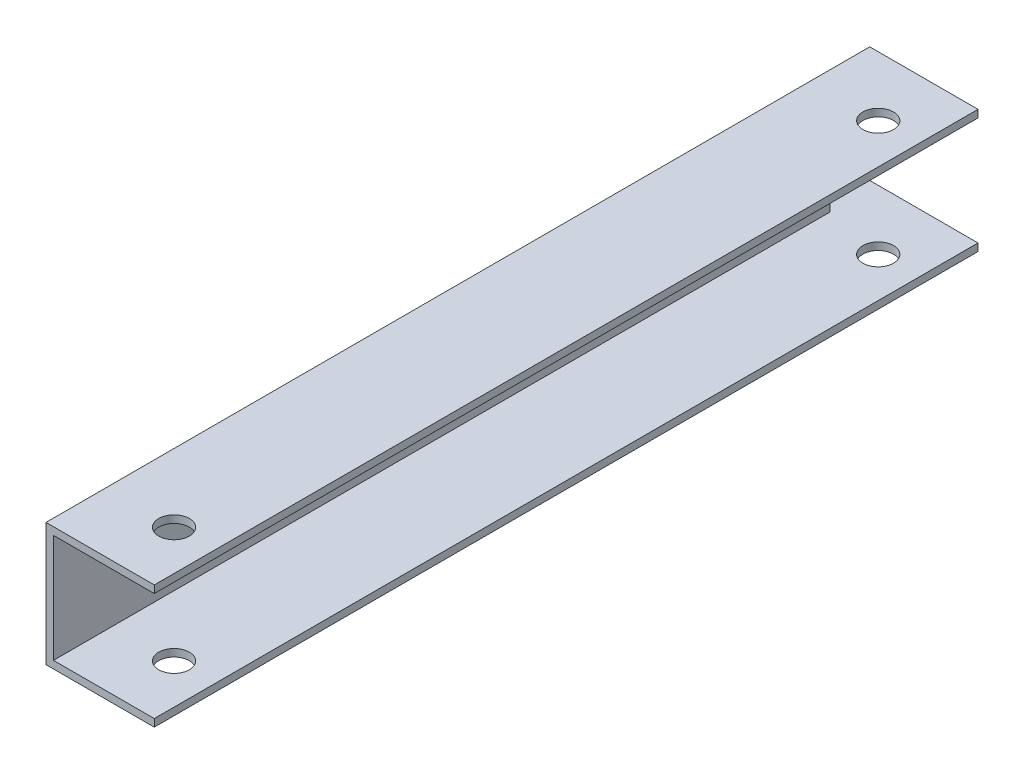
ISO-10303-21;
HEADER;
FILE_DESCRIPTION(('STEP AP214'),'2;1');
FILE_NAME('part.step','',(''),(''),'','','');
FILE_SCHEMA(('AUTOMOTIVE_DESIGN { 1 0 10303 214 1 1 1 1 }'));
ENDSEC;
DATA;
#1=APPLICATION_CONTEXT('core data for automotive mechanical design processes');
#2=APPLICATION_PROTOCOL_DEFINITION('international standard','automotive_design',2000,#1);
#3=PRODUCT_CONTEXT('',#1,'mechanical');
#4=PRODUCT('Part','Part','',(#3));
#5=PRODUCT_RELATED_PRODUCT_CATEGORY('part','',(#4));
#6=PRODUCT_DEFINITION_FORMATION('','',#4);
#7=PRODUCT_DEFINITION_CONTEXT('part definition',#1,'design');
#8=PRODUCT_DEFINITION('design','',#6,#7);
#9=PRODUCT_DEFINITION_SHAPE('','',#8);
#10=(LENGTH_UNIT() NAMED_UNIT(*) SI_UNIT(.MILLI.,.METRE.));
#11=(NAMED_UNIT(*) PLANE_ANGLE_UNIT() SI_UNIT($,.RADIAN.));
#12=(NAMED_UNIT(*) SI_UNIT($,.STERADIAN.) SOLID_ANGLE_UNIT());
#13=UNCERTAINTY_MEASURE_WITH_UNIT(LENGTH_MEASURE(1.E-05),#10,'distance_accuracy_value','');
#14=(GEOMETRIC_REPRESENTATION_CONTEXT(3) GLOBAL_UNCERTAINTY_ASSIGNED_CONTEXT((#13)) GLOBAL_UNIT_ASSIGNED_CONTEXT((#10,
#11,#12)) REPRESENTATION_CONTEXT('',''));
#15=CARTESIAN_POINT('',(0.,0.,0.));
#16=DIRECTION('',(0.,0.,1.));
#17=DIRECTION('',(1.,0.,0.));
#18=AXIS2_PLACEMENT_3D('',#15,#16,#17);
#19=CARTESIAN_POINT('',(0.,0.,-175.));
#20=DIRECTION('',(0.,0.,-1.));
#21=DIRECTION('',(-1.,0.,0.));
#22=AXIS2_PLACEMENT_3D('',#19,#20,#21);
#23=PLANE('',#22);
#24=DIRECTION('',(1.,0.,0.));
#25=VECTOR('',#24,1.);
#26=CARTESIAN_POINT('',(23.,23.,-175.));
#27=LINE('',#26,#25);
#28=CARTESIAN_POINT('',(-23.,23.,-175.));
#29=VERTEX_POINT('',#28);
#30=CARTESIAN_POINT('',(23.,23.,-175.));
#31=VERTEX_POINT('',#30);
#32=EDGE_CURVE('E83',#29,#31,#27,.T.);
#33=ORIENTED_EDGE('',*,*,#32,.F.);
#34=DIRECTION('',(0.,-1.,0.));
#35=VECTOR('',#34,1.);
#36=CARTESIAN_POINT('',(-23.,-26.175,-175.));
#37=LINE('',#36,#35);
#38=CARTESIAN_POINT('',(-23.,26.175,-175.));
#39=VERTEX_POINT('',#38);
#40=EDGE_CURVE('E144',#39,#29,#37,.T.);
#41=ORIENTED_EDGE('',*,*,#40,.F.);
#42=DIRECTION('',(-1.,0.,0.));
#43=VECTOR('',#42,1.);
#44=CARTESIAN_POINT('',(-23.,26.175,-175.));
#45=LINE('',#44,#43);
#46=CARTESIAN_POINT('',(23.,26.175,-175.));
#47=VERTEX_POINT('',#46);
#48=EDGE_CURVE('E140',#47,#39,#45,.T.);
#49=ORIENTED_EDGE('',*,*,#48,.F.);
#50=DIRECTION('',(0.,1.,0.));
#51=VECTOR('',#50,1.);
#52=CARTESIAN_POINT('',(23.,26.175,-175.));
#53=LINE('',#52,#51);
#54=EDGE_CURVE('E137',#31,#47,#53,.T.);
#55=ORIENTED_EDGE('',*,*,#54,.F.);
#56=EDGE_LOOP('',(#33,#41,#49,#55));
#57=FACE_BOUND('',#56,.T.);
#58=ADVANCED_FACE('F33',(#57),#23,.T.);
#59=CARTESIAN_POINT('',(23.,26.175,175.));
#60=DIRECTION('',(-1.,0.,0.));
#61=DIRECTION('',(0.,0.,1.));
#62=AXIS2_PLACEMENT_3D('',#59,#60,#61);
#63=PLANE('',#62);
#64=ORIENTED_EDGE('',*,*,#54,.T.);
#65=DIRECTION('',(0.,0.,-1.));
#66=VECTOR('',#65,1.);
#67=CARTESIAN_POINT('',(23.,26.175,175.));
#68=LINE('',#67,#66);
#69=CARTESIAN_POINT('',(23.,26.175,175.));
#70=VERTEX_POINT('',#69);
#71=EDGE_CURVE('E11',#70,#47,#68,.T.);
#72=ORIENTED_EDGE('',*,*,#71,.F.);
#73=DIRECTION('',(0.,1.,0.));
#74=VECTOR('',#73,1.);
#75=CARTESIAN_POINT('',(23.,26.175,175.));
#76=LINE('',#75,#74);
#77=CARTESIAN_POINT('',(23.,23.,175.));
#78=VERTEX_POINT('',#77);
#79=EDGE_CURVE('E154',#78,#70,#76,.T.);
#80=ORIENTED_EDGE('',*,*,#79,.F.);
#81=DIRECTION('',(0.,0.,-1.));
#82=VECTOR('',#81,1.);
#83=CARTESIAN_POINT('',(23.,23.,175.));
#84=LINE('',#83,#82);
#85=EDGE_CURVE('E133',#78,#31,#84,.T.);
#86=ORIENTED_EDGE('',*,*,#85,.T.);
#87=EDGE_LOOP('',(#64,#72,#80,#86));
#88=FACE_BOUND('',#87,.T.);
#89=ADVANCED_FACE('F35',(#88),#63,.F.);
#90=CARTESIAN_POINT('',(-23.,26.175,175.));
#91=DIRECTION('',(0.,-1.,0.));
#92=DIRECTION('',(0.,0.,-1.));
#93=AXIS2_PLACEMENT_3D('',#90,#91,#92);
#94=PLANE('',#93);
#95=CARTESIAN_POINT('',(5.99999999999999,26.175,149.6));
#96=DIRECTION('',(0.,-1.,0.));
#97=DIRECTION('',(0.,0.,-1.));
#98=AXIS2_PLACEMENT_3D('',#95,#96,#97);
#99=CIRCLE('',#98,6.50000000000001);
#100=CARTESIAN_POINT('',(5.99999999999999,26.175,143.1));
#101=VERTEX_POINT('',#100);
#102=EDGE_CURVE('E141',#101,#101,#99,.T.);
#103=ORIENTED_EDGE('',*,*,#102,.T.);
#104=EDGE_LOOP('',(#103));
#105=FACE_BOUND('',#104,.T.);
#106=CARTESIAN_POINT('',(6.00000000000003,26.175,-149.6));
#107=DIRECTION('',(0.,-1.,0.));
#108=DIRECTION('',(0.,0.,-1.));
#109=AXIS2_PLACEMENT_3D('',#106,#107,#108);
#110=CIRCLE('',#109,6.50000000000001);
#111=CARTESIAN_POINT('',(6.00000000000003,26.175,-156.1));
#112=VERTEX_POINT('',#111);
#113=EDGE_CURVE('E171',#112,#112,#110,.T.);
#114=ORIENTED_EDGE('',*,*,#113,.T.);
#115=EDGE_LOOP('',(#114));
#116=FACE_BOUND('',#115,.T.);
#117=ORIENTED_EDGE('',*,*,#48,.T.);
#118=DIRECTION('',(0.,0.,-1.));
#119=VECTOR('',#118,1.);
#120=CARTESIAN_POINT('',(-23.,26.175,175.));
#121=LINE('',#120,#119);
#122=CARTESIAN_POINT('',(-23.,26.175,175.));
#123=VERTEX_POINT('',#122);
#124=EDGE_CURVE('E43',#123,#39,#121,.T.);
#125=ORIENTED_EDGE('',*,*,#124,.F.);
#126=DIRECTION('',(-1.,0.,0.));
#127=VECTOR('',#126,1.);
#128=CARTESIAN_POINT('',(-23.,26.175,175.));
#129=LINE('',#128,#127);
#130=EDGE_CURVE('E91',#70,#123,#129,.T.);
#131=ORIENTED_EDGE('',*,*,#130,.F.);
#132=ORIENTED_EDGE('',*,*,#71,.T.);
#133=EDGE_LOOP('',(#117,#125,#131,#132));
#134=FACE_BOUND('',#133,.T.);
#135=ADVANCED_FACE('F240',(#105,#116,#134),#94,.F.);
#136=CARTESIAN_POINT('',(-23.,-26.175,175.));
#137=DIRECTION('',(1.,0.,0.));
#138=DIRECTION('',(0.,0.,-1.));
#139=AXIS2_PLACEMENT_3D('',#136,#137,#138);
#140=PLANE('',#139);
#141=ORIENTED_EDGE('',*,*,#40,.T.);
#142=DIRECTION('',(0.,0.,-1.));
#143=VECTOR('',#142,1.);
#144=CARTESIAN_POINT('',(-23.,23.,-175.));
#145=LINE('',#144,#143);
#146=CARTESIAN_POINT('',(-23.,23.,-155.));
#147=VERTEX_POINT('',#146);
#148=EDGE_CURVE('E220',#147,#29,#145,.T.);
#149=ORIENTED_EDGE('',*,*,#148,.F.);
#150=DIRECTION('',(0.,1.,0.));
#151=VECTOR('',#150,1.);
#152=CARTESIAN_POINT('',(-23.,23.,-155.));
#153=LINE('',#152,#151);
#154=CARTESIAN_POINT('',(-23.,-23.,-155.));
#155=VERTEX_POINT('',#154);
#156=EDGE_CURVE('E218',#155,#147,#153,.T.);
#157=ORIENTED_EDGE('',*,*,#156,.F.);
#158=DIRECTION('',(0.,0.,1.));
#159=VECTOR('',#158,1.);
#160=CARTESIAN_POINT('',(-23.,-23.,-175.));
#161=LINE('',#160,#159);
#162=CARTESIAN_POINT('',(-23.,-23.,-175.));
#163=VERTEX_POINT('',#162);
#164=EDGE_CURVE('E215',#163,#155,#161,.T.);
#165=ORIENTED_EDGE('',*,*,#164,.F.);
#166=CARTESIAN_POINT('',(-23.,-26.175,-175.));
#167=VERTEX_POINT('',#166);
#168=EDGE_CURVE('E143',#163,#167,#37,.T.);
#169=ORIENTED_EDGE('',*,*,#168,.T.);
#170=DIRECTION('',(0.,0.,-1.));
#171=VECTOR('',#170,1.);
#172=CARTESIAN_POINT('',(-23.,-26.175,175.));
#173=LINE('',#172,#171);
#174=CARTESIAN_POINT('',(-23.,-26.175,175.));
#175=VERTEX_POINT('',#174);
#176=EDGE_CURVE('E160',#175,#167,#173,.T.);
#177=ORIENTED_EDGE('',*,*,#176,.F.);
#178=DIRECTION('',(0.,-1.,0.));
#179=VECTOR('',#178,1.);
#180=CARTESIAN_POINT('',(-23.,-26.175,175.));
#181=LINE('',#180,#179);
#182=EDGE_CURVE('E193',#123,#175,#181,.T.);
#183=ORIENTED_EDGE('',*,*,#182,.F.);
#184=ORIENTED_EDGE('',*,*,#124,.T.);
#185=EDGE_LOOP('',(#141,#149,#157,#165,#169,#177,#183,#184));
#186=FACE_BOUND('',#185,.T.);
#187=ADVANCED_FACE('F213',(#186),#140,.F.);
#188=CARTESIAN_POINT('',(23.,-26.175,175.));
#189=DIRECTION('',(0.,1.,0.));
#190=DIRECTION('',(-1.,0.,0.));
#191=AXIS2_PLACEMENT_3D('',#188,#189,#190);
#192=PLANE('',#191);
#193=CARTESIAN_POINT('',(6.,-26.175,149.6));
#194=DIRECTION('',(0.,-1.,0.));
#195=DIRECTION('',(1.,0.,0.));
#196=AXIS2_PLACEMENT_3D('',#193,#194,#195);
#197=CIRCLE('',#196,6.50000000000001);
#198=CARTESIAN_POINT('',(12.5,-26.175,149.6));
#199=VERTEX_POINT('',#198);
#200=EDGE_CURVE('E167',#199,#199,#197,.T.);
#201=ORIENTED_EDGE('',*,*,#200,.F.);
#202=EDGE_LOOP('',(#201));
#203=FACE_BOUND('',#202,.T.);
#204=CARTESIAN_POINT('',(6.00000000000003,-26.175,-149.6));
#205=DIRECTION('',(0.,-1.,0.));
#206=DIRECTION('',(-1.,0.,0.));
#207=AXIS2_PLACEMENT_3D('',#204,#205,#206);
#208=CIRCLE('',#207,6.50000000000001);
#209=CARTESIAN_POINT('',(-0.499999999999971,-26.175,-149.6));
#210=VERTEX_POINT('',#209);
#211=EDGE_CURVE('E174',#210,#210,#208,.T.);
#212=ORIENTED_EDGE('',*,*,#211,.F.);
#213=EDGE_LOOP('',(#212));
#214=FACE_BOUND('',#213,.T.);
#215=DIRECTION('',(1.,0.,0.));
#216=VECTOR('',#215,1.);
#217=CARTESIAN_POINT('',(23.,-26.175,-175.));
#218=LINE('',#217,#216);
#219=CARTESIAN_POINT('',(23.,-26.175,-175.));
#220=VERTEX_POINT('',#219);
#221=EDGE_CURVE('E147',#167,#220,#218,.T.);
#222=ORIENTED_EDGE('',*,*,#221,.T.);
#223=DIRECTION('',(0.,0.,-1.));
#224=VECTOR('',#223,1.);
#225=CARTESIAN_POINT('',(23.,-26.175,175.));
#226=LINE('',#225,#224);
#227=CARTESIAN_POINT('',(23.,-26.175,175.));
#228=VERTEX_POINT('',#227);
#229=EDGE_CURVE('E158',#228,#220,#226,.T.);
#230=ORIENTED_EDGE('',*,*,#229,.F.);
#231=DIRECTION('',(1.,0.,0.));
#232=VECTOR('',#231,1.);
#233=CARTESIAN_POINT('',(23.,-26.175,175.));
#234=LINE('',#233,#232);
#235=EDGE_CURVE('E195',#175,#228,#234,.T.);
#236=ORIENTED_EDGE('',*,*,#235,.F.);
#237=ORIENTED_EDGE('',*,*,#176,.T.);
#238=EDGE_LOOP('',(#222,#230,#236,#237));
#239=FACE_BOUND('',#238,.T.);
#240=ADVANCED_FACE('F201',(#203,#214,#239),#192,.F.);
#241=CARTESIAN_POINT('',(23.,-23.,175.));
#242=DIRECTION('',(-1.,0.,0.));
#243=DIRECTION('',(0.,-1.,0.));
#244=AXIS2_PLACEMENT_3D('',#241,#242,#243);
#245=PLANE('',#244);
#246=DIRECTION('',(0.,1.,0.));
#247=VECTOR('',#246,1.);
#248=CARTESIAN_POINT('',(23.,-23.,-175.));
#249=LINE('',#248,#247);
#250=CARTESIAN_POINT('',(23.,-23.,-175.));
#251=VERTEX_POINT('',#250);
#252=EDGE_CURVE('E76',#220,#251,#249,.T.);
#253=ORIENTED_EDGE('',*,*,#252,.T.);
#254=DIRECTION('',(0.,0.,-1.));
#255=VECTOR('',#254,1.);
#256=CARTESIAN_POINT('',(23.,-23.,175.));
#257=LINE('',#256,#255);
#258=CARTESIAN_POINT('',(23.,-23.,175.));
#259=VERTEX_POINT('',#258);
#260=EDGE_CURVE('E127',#259,#251,#257,.T.);
#261=ORIENTED_EDGE('',*,*,#260,.F.);
#262=DIRECTION('',(0.,1.,0.));
#263=VECTOR('',#262,1.);
#264=CARTESIAN_POINT('',(23.,-23.,175.));
#265=LINE('',#264,#263);
#266=EDGE_CURVE('E113',#228,#259,#265,.T.);
#267=ORIENTED_EDGE('',*,*,#266,.F.);
#268=ORIENTED_EDGE('',*,*,#229,.T.);
#269=EDGE_LOOP('',(#253,#261,#267,#268));
#270=FACE_BOUND('',#269,.T.);
#271=ADVANCED_FACE('F203',(#270),#245,.F.);
#272=CARTESIAN_POINT('',(-19.825,-23.,175.));
#273=DIRECTION('',(0.,-1.,0.));
#274=DIRECTION('',(1.,0.,0.));
#275=AXIS2_PLACEMENT_3D('',#272,#273,#274);
#276=PLANE('',#275);
#277=DIRECTION('',(-1.,0.,0.));
#278=VECTOR('',#277,1.);
#279=CARTESIAN_POINT('',(-13.,-23.,-155.));
#280=LINE('',#279,#278);
#281=CARTESIAN_POINT('',(-19.825,-23.,-155.));
#282=VERTEX_POINT('',#281);
#283=EDGE_CURVE('E124',#282,#155,#280,.T.);
#284=ORIENTED_EDGE('',*,*,#283,.F.);
#285=DIRECTION('',(0.,0.,-1.));
#286=VECTOR('',#285,1.);
#287=CARTESIAN_POINT('',(-19.825,-23.,175.));
#288=LINE('',#287,#286);
#289=CARTESIAN_POINT('',(-19.825,-23.,175.));
#290=VERTEX_POINT('',#289);
#291=EDGE_CURVE('E118',#290,#282,#288,.T.);
#292=ORIENTED_EDGE('',*,*,#291,.F.);
#293=DIRECTION('',(-1.,0.,0.));
#294=VECTOR('',#293,1.);
#295=CARTESIAN_POINT('',(-19.825,-23.,175.));
#296=LINE('',#295,#294);
#297=EDGE_CURVE('E106',#259,#290,#296,.T.);
#298=ORIENTED_EDGE('',*,*,#297,.F.);
#299=ORIENTED_EDGE('',*,*,#260,.T.);
#300=DIRECTION('',(-1.,0.,0.));
#301=VECTOR('',#300,1.);
#302=CARTESIAN_POINT('',(-19.825,-23.,-175.));
#303=LINE('',#302,#301);
#304=EDGE_CURVE('E150',#251,#163,#303,.T.);
#305=ORIENTED_EDGE('',*,*,#304,.T.);
#306=ORIENTED_EDGE('',*,*,#164,.T.);
#307=EDGE_LOOP('',(#284,#292,#298,#299,#305,#306));
#308=FACE_BOUND('',#307,.T.);
#309=CARTESIAN_POINT('',(6.,-23.,149.6));
#310=DIRECTION('',(0.,-1.,0.));
#311=DIRECTION('',(1.,0.,0.));
#312=AXIS2_PLACEMENT_3D('',#309,#310,#311);
#313=CIRCLE('',#312,6.50000000000001);
#314=CARTESIAN_POINT('',(12.5,-23.,149.6));
#315=VERTEX_POINT('',#314);
#316=EDGE_CURVE('E186',#315,#315,#313,.T.);
#317=ORIENTED_EDGE('',*,*,#316,.T.);
#318=EDGE_LOOP('',(#317));
#319=FACE_BOUND('',#318,.T.);
#320=CARTESIAN_POINT('',(6.00000000000003,-23.,-149.6));
#321=DIRECTION('',(0.,-1.,0.));
#322=DIRECTION('',(1.,0.,0.));
#323=AXIS2_PLACEMENT_3D('',#320,#321,#322);
#324=CIRCLE('',#323,6.50000000000001);
#325=CARTESIAN_POINT('',(12.5,-23.,-149.6));
#326=VERTEX_POINT('',#325);
#327=EDGE_CURVE('E166',#326,#326,#324,.T.);
#328=ORIENTED_EDGE('',*,*,#327,.T.);
#329=EDGE_LOOP('',(#328));
#330=FACE_BOUND('',#329,.T.);
#331=ADVANCED_FACE('F119',(#308,#319,#330),#276,.F.);
#332=CARTESIAN_POINT('',(-19.825,23.,175.));
#333=DIRECTION('',(-1.,0.,0.));
#334=DIRECTION('',(0.,-1.,0.));
#335=AXIS2_PLACEMENT_3D('',#332,#333,#334);
#336=PLANE('',#335);
#337=ORIENTED_EDGE('',*,*,#291,.T.);
#338=DIRECTION('',(0.,1.,0.));
#339=VECTOR('',#338,1.);
#340=CARTESIAN_POINT('',(-19.825,23.,-155.));
#341=LINE('',#340,#339);
#342=CARTESIAN_POINT('',(-19.825,23.,-155.));
#343=VERTEX_POINT('',#342);
#344=EDGE_CURVE('E179',#282,#343,#341,.T.);
#345=ORIENTED_EDGE('',*,*,#344,.T.);
#346=DIRECTION('',(0.,0.,-1.));
#347=VECTOR('',#346,1.);
#348=CARTESIAN_POINT('',(-19.825,23.,175.));
#349=LINE('',#348,#347);
#350=CARTESIAN_POINT('',(-19.825,23.,175.));
#351=VERTEX_POINT('',#350);
#352=EDGE_CURVE('E128',#351,#343,#349,.T.);
#353=ORIENTED_EDGE('',*,*,#352,.F.);
#354=DIRECTION('',(0.,1.,0.));
#355=VECTOR('',#354,1.);
#356=CARTESIAN_POINT('',(-19.825,23.,175.));
#357=LINE('',#356,#355);
#358=EDGE_CURVE('E110',#290,#351,#357,.T.);
#359=ORIENTED_EDGE('',*,*,#358,.F.);
#360=EDGE_LOOP('',(#337,#345,#353,#359));
#361=FACE_BOUND('',#360,.T.);
#362=ADVANCED_FACE('F130',(#361),#336,.F.);
#363=CARTESIAN_POINT('',(23.,23.,175.));
#364=DIRECTION('',(0.,1.,0.));
#365=DIRECTION('',(0.,0.,1.));
#366=AXIS2_PLACEMENT_3D('',#363,#364,#365);
#367=PLANE('',#366);
#368=CARTESIAN_POINT('',(5.99999999999999,23.,149.6));
#369=DIRECTION('',(0.,1.,0.));
#370=DIRECTION('',(0.,0.,1.));
#371=AXIS2_PLACEMENT_3D('',#368,#369,#370);
#372=CIRCLE('',#371,6.50000000000001);
#373=CARTESIAN_POINT('',(5.99999999999999,23.,156.1));
#374=VERTEX_POINT('',#373);
#375=EDGE_CURVE('E37',#374,#374,#372,.T.);
#376=ORIENTED_EDGE('',*,*,#375,.T.);
#377=EDGE_LOOP('',(#376));
#378=FACE_BOUND('',#377,.T.);
#379=CARTESIAN_POINT('',(6.00000000000003,23.,-149.6));
#380=DIRECTION('',(0.,1.,0.));
#381=DIRECTION('',(0.,0.,1.));
#382=AXIS2_PLACEMENT_3D('',#379,#380,#381);
#383=CIRCLE('',#382,6.50000000000001);
#384=CARTESIAN_POINT('',(6.00000000000003,23.,-143.1));
#385=VERTEX_POINT('',#384);
#386=EDGE_CURVE('E164',#385,#385,#383,.T.);
#387=ORIENTED_EDGE('',*,*,#386,.T.);
#388=EDGE_LOOP('',(#387));
#389=FACE_BOUND('',#388,.T.);
#390=ORIENTED_EDGE('',*,*,#352,.T.);
#391=DIRECTION('',(-1.,0.,0.));
#392=VECTOR('',#391,1.);
#393=CARTESIAN_POINT('',(-13.,23.,-155.));
#394=LINE('',#393,#392);
#395=EDGE_CURVE('E224',#343,#147,#394,.T.);
#396=ORIENTED_EDGE('',*,*,#395,.T.);
#397=ORIENTED_EDGE('',*,*,#148,.T.);
#398=ORIENTED_EDGE('',*,*,#32,.T.);
#399=ORIENTED_EDGE('',*,*,#85,.F.);
#400=DIRECTION('',(1.,0.,0.));
#401=VECTOR('',#400,1.);
#402=CARTESIAN_POINT('',(23.,23.,175.));
#403=LINE('',#402,#401);
#404=EDGE_CURVE('E52',#351,#78,#403,.T.);
#405=ORIENTED_EDGE('',*,*,#404,.F.);
#406=EDGE_LOOP('',(#390,#396,#397,#398,#399,#405));
#407=FACE_BOUND('',#406,.T.);
#408=ADVANCED_FACE('F235',(#378,#389,#407),#367,.F.);
#409=CARTESIAN_POINT('',(0.,0.,175.));
#410=DIRECTION('',(0.,0.,-1.));
#411=DIRECTION('',(-1.,0.,0.));
#412=AXIS2_PLACEMENT_3D('',#409,#410,#411);
#413=PLANE('',#412);
#414=ORIENTED_EDGE('',*,*,#79,.T.);
#415=ORIENTED_EDGE('',*,*,#130,.T.);
#416=ORIENTED_EDGE('',*,*,#182,.T.);
#417=ORIENTED_EDGE('',*,*,#235,.T.);
#418=ORIENTED_EDGE('',*,*,#266,.T.);
#419=ORIENTED_EDGE('',*,*,#297,.T.);
#420=ORIENTED_EDGE('',*,*,#358,.T.);
#421=ORIENTED_EDGE('',*,*,#404,.T.);
#422=EDGE_LOOP('',(#414,#415,#416,#417,#418,#419,#420,#421));
#423=FACE_BOUND('',#422,.T.);
#424=ADVANCED_FACE('F108',(#423),#413,.F.);
#425=ORIENTED_EDGE('',*,*,#168,.F.);
#426=ORIENTED_EDGE('',*,*,#304,.F.);
#427=ORIENTED_EDGE('',*,*,#252,.F.);
#428=ORIENTED_EDGE('',*,*,#221,.F.);
#429=EDGE_LOOP('',(#425,#426,#427,#428));
#430=FACE_BOUND('',#429,.T.);
#431=ADVANCED_FACE('F209',(#430),#23,.T.);
#432=CARTESIAN_POINT('',(5.99999999999999,273.825,-149.6));
#433=DIRECTION('',(0.,-1.,0.));
#434=DIRECTION('',(1.,0.,0.));
#435=AXIS2_PLACEMENT_3D('',#432,#433,#434);
#436=CYLINDRICAL_SURFACE('',#435,6.50000000000001);
#437=ORIENTED_EDGE('',*,*,#386,.F.);
#438=EDGE_LOOP('',(#437));
#439=FACE_BOUND('',#438,.T.);
#440=ORIENTED_EDGE('',*,*,#113,.F.);
#441=EDGE_LOOP('',(#440));
#442=FACE_BOUND('',#441,.T.);
#443=ADVANCED_FACE('F251',(#439,#442),#436,.F.);
#444=CARTESIAN_POINT('',(5.99999999999995,273.825,149.6));
#445=DIRECTION('',(0.,-1.,0.));
#446=DIRECTION('',(1.,0.,0.));
#447=AXIS2_PLACEMENT_3D('',#444,#445,#446);
#448=CYLINDRICAL_SURFACE('',#447,6.50000000000001);
#449=ORIENTED_EDGE('',*,*,#375,.F.);
#450=EDGE_LOOP('',(#449));
#451=FACE_BOUND('',#450,.T.);
#452=ORIENTED_EDGE('',*,*,#102,.F.);
#453=EDGE_LOOP('',(#452));
#454=FACE_BOUND('',#453,.T.);
#455=ADVANCED_FACE('F256',(#451,#454),#448,.F.);
#456=ORIENTED_EDGE('',*,*,#211,.T.);
#457=EDGE_LOOP('',(#456));
#458=FACE_BOUND('',#457,.T.);
#459=ORIENTED_EDGE('',*,*,#327,.F.);
#460=EDGE_LOOP('',(#459));
#461=FACE_BOUND('',#460,.T.);
#462=ADVANCED_FACE('F259',(#458,#461),#436,.F.);
#463=ORIENTED_EDGE('',*,*,#200,.T.);
#464=EDGE_LOOP('',(#463));
#465=FACE_BOUND('',#464,.T.);
#466=ORIENTED_EDGE('',*,*,#316,.F.);
#467=EDGE_LOOP('',(#466));
#468=FACE_BOUND('',#467,.T.);
#469=ADVANCED_FACE('F268',(#465,#468),#448,.F.);
#470=CARTESIAN_POINT('',(-13.,23.,-155.));
#471=DIRECTION('',(0.,0.,1.));
#472=DIRECTION('',(1.,0.,0.));
#473=AXIS2_PLACEMENT_3D('',#470,#471,#472);
#474=PLANE('',#473);
#475=ORIENTED_EDGE('',*,*,#283,.T.);
#476=ORIENTED_EDGE('',*,*,#156,.T.);
#477=ORIENTED_EDGE('',*,*,#395,.F.);
#478=ORIENTED_EDGE('',*,*,#344,.F.);
#479=EDGE_LOOP('',(#475,#476,#477,#478));
#480=FACE_BOUND('',#479,.T.);
#481=ADVANCED_FACE('F228',(#480),#474,.F.);
#482=CLOSED_SHELL('',(#58,#89,#135,#187,#240,#271,#331,#362,#408,#424,#431,#443,#455,#462,#469,#481));
#483=MANIFOLD_SOLID_BREP('B2',#482);
#484=ADVANCED_BREP_SHAPE_REPRESENTATION('',(#18,#483),#14);
#485=SHAPE_DEFINITION_REPRESENTATION(#9,#484);
ENDSEC;
END-ISO-10303-21;
